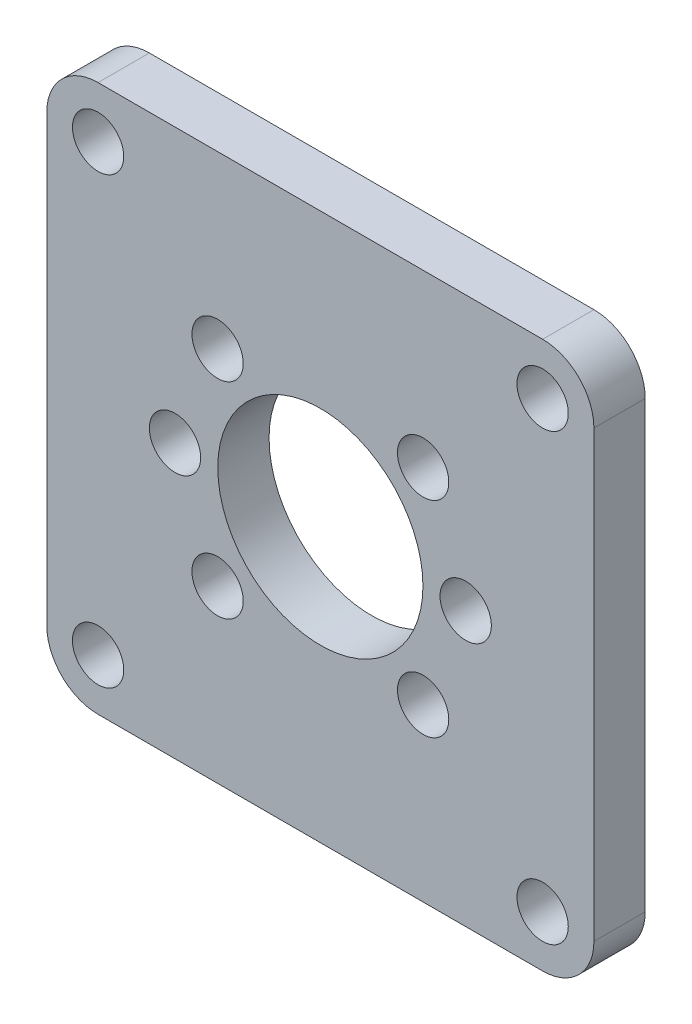
ISO-10303-21;
HEADER;
FILE_DESCRIPTION(('STEP AP214'),'2;1');
FILE_NAME('part.step','',(''),(''),'','','');
FILE_SCHEMA(('AUTOMOTIVE_DESIGN { 1 0 10303 214 1 1 1 1 }'));
ENDSEC;
DATA;
#1=APPLICATION_CONTEXT('core data for automotive mechanical design processes');
#2=APPLICATION_PROTOCOL_DEFINITION('international standard','automotive_design',2000,#1);
#3=PRODUCT_CONTEXT('',#1,'mechanical');
#4=PRODUCT('Part','Part','',(#3));
#5=PRODUCT_RELATED_PRODUCT_CATEGORY('part','',(#4));
#6=PRODUCT_DEFINITION_FORMATION('','',#4);
#7=PRODUCT_DEFINITION_CONTEXT('part definition',#1,'design');
#8=PRODUCT_DEFINITION('design','',#6,#7);
#9=PRODUCT_DEFINITION_SHAPE('','',#8);
#10=(LENGTH_UNIT() NAMED_UNIT(*) SI_UNIT(.MILLI.,.METRE.));
#11=(NAMED_UNIT(*) PLANE_ANGLE_UNIT() SI_UNIT($,.RADIAN.));
#12=(NAMED_UNIT(*) SI_UNIT($,.STERADIAN.) SOLID_ANGLE_UNIT());
#13=UNCERTAINTY_MEASURE_WITH_UNIT(LENGTH_MEASURE(1.E-05),#10,'distance_accuracy_value','');
#14=(GEOMETRIC_REPRESENTATION_CONTEXT(3) GLOBAL_UNCERTAINTY_ASSIGNED_CONTEXT((#13)) GLOBAL_UNIT_ASSIGNED_CONTEXT((#10,
#11,#12)) REPRESENTATION_CONTEXT('',''));
#15=CARTESIAN_POINT('',(0.,0.,0.));
#16=DIRECTION('',(0.,0.,1.));
#17=DIRECTION('',(1.,0.,0.));
#18=AXIS2_PLACEMENT_3D('',#15,#16,#17);
#19=CARTESIAN_POINT('',(-13.,-13.,3.));
#20=DIRECTION('',(0.,0.,-1.));
#21=DIRECTION('',(-1.,0.,0.));
#22=AXIS2_PLACEMENT_3D('',#19,#20,#21);
#23=CYLINDRICAL_SURFACE('',#22,3.);
#24=CARTESIAN_POINT('',(-13.,-13.,0.));
#25=DIRECTION('',(0.,0.,1.));
#26=DIRECTION('',(1.,0.,0.));
#27=AXIS2_PLACEMENT_3D('',#24,#25,#26);
#28=CIRCLE('',#27,3.);
#29=CARTESIAN_POINT('',(-16.,-13.,0.));
#30=VERTEX_POINT('',#29);
#31=CARTESIAN_POINT('',(-13.,-16.,0.));
#32=VERTEX_POINT('',#31);
#33=EDGE_CURVE('E140',#30,#32,#28,.T.);
#34=ORIENTED_EDGE('',*,*,#33,.T.);
#35=DIRECTION('',(0.,0.,-1.));
#36=VECTOR('',#35,1.);
#37=CARTESIAN_POINT('',(-13.,-16.,3.));
#38=LINE('',#37,#36);
#39=CARTESIAN_POINT('',(-13.,-16.,3.));
#40=VERTEX_POINT('',#39);
#41=EDGE_CURVE('E11',#40,#32,#38,.T.);
#42=ORIENTED_EDGE('',*,*,#41,.F.);
#43=CARTESIAN_POINT('',(-13.,-13.,3.));
#44=DIRECTION('',(0.,0.,1.));
#45=DIRECTION('',(1.,0.,0.));
#46=AXIS2_PLACEMENT_3D('',#43,#44,#45);
#47=CIRCLE('',#46,3.);
#48=CARTESIAN_POINT('',(-16.,-13.,3.));
#49=VERTEX_POINT('',#48);
#50=EDGE_CURVE('E163',#49,#40,#47,.T.);
#51=ORIENTED_EDGE('',*,*,#50,.F.);
#52=DIRECTION('',(0.,0.,-1.));
#53=VECTOR('',#52,1.);
#54=CARTESIAN_POINT('',(-16.,-13.,3.));
#55=LINE('',#54,#53);
#56=EDGE_CURVE('E136',#49,#30,#55,.T.);
#57=ORIENTED_EDGE('',*,*,#56,.T.);
#58=EDGE_LOOP('',(#34,#42,#51,#57));
#59=FACE_BOUND('',#58,.T.);
#60=ADVANCED_FACE('F39',(#59),#23,.T.);
#61=CARTESIAN_POINT('',(-13.,-16.,3.));
#62=DIRECTION('',(0.,1.,0.));
#63=DIRECTION('',(0.,0.,1.));
#64=AXIS2_PLACEMENT_3D('',#61,#62,#63);
#65=PLANE('',#64);
#66=DIRECTION('',(1.,0.,0.));
#67=VECTOR('',#66,1.);
#68=CARTESIAN_POINT('',(-13.,-16.,0.));
#69=LINE('',#68,#67);
#70=CARTESIAN_POINT('',(13.,-16.,0.));
#71=VERTEX_POINT('',#70);
#72=EDGE_CURVE('E144',#32,#71,#69,.T.);
#73=ORIENTED_EDGE('',*,*,#72,.T.);
#74=DIRECTION('',(0.,0.,-1.));
#75=VECTOR('',#74,1.);
#76=CARTESIAN_POINT('',(13.,-16.,3.));
#77=LINE('',#76,#75);
#78=CARTESIAN_POINT('',(13.,-16.,3.));
#79=VERTEX_POINT('',#78);
#80=EDGE_CURVE('E48',#79,#71,#77,.T.);
#81=ORIENTED_EDGE('',*,*,#80,.F.);
#82=DIRECTION('',(1.,0.,0.));
#83=VECTOR('',#82,1.);
#84=CARTESIAN_POINT('',(-13.,-16.,3.));
#85=LINE('',#84,#83);
#86=EDGE_CURVE('E99',#40,#79,#85,.T.);
#87=ORIENTED_EDGE('',*,*,#86,.F.);
#88=ORIENTED_EDGE('',*,*,#41,.T.);
#89=EDGE_LOOP('',(#73,#81,#87,#88));
#90=FACE_BOUND('',#89,.T.);
#91=ADVANCED_FACE('F343',(#90),#65,.F.);
#92=CARTESIAN_POINT('',(13.,-13.,3.));
#93=DIRECTION('',(0.,0.,-1.));
#94=DIRECTION('',(-1.,0.,0.));
#95=AXIS2_PLACEMENT_3D('',#92,#93,#94);
#96=CYLINDRICAL_SURFACE('',#95,3.);
#97=CARTESIAN_POINT('',(13.,-13.,0.));
#98=DIRECTION('',(0.,0.,1.));
#99=DIRECTION('',(1.,0.,0.));
#100=AXIS2_PLACEMENT_3D('',#97,#98,#99);
#101=CIRCLE('',#100,3.);
#102=CARTESIAN_POINT('',(16.,-13.,0.));
#103=VERTEX_POINT('',#102);
#104=EDGE_CURVE('E148',#71,#103,#101,.T.);
#105=ORIENTED_EDGE('',*,*,#104,.T.);
#106=DIRECTION('',(0.,0.,-1.));
#107=VECTOR('',#106,1.);
#108=CARTESIAN_POINT('',(16.,-13.,3.));
#109=LINE('',#108,#107);
#110=CARTESIAN_POINT('',(16.,-13.,3.));
#111=VERTEX_POINT('',#110);
#112=EDGE_CURVE('E174',#111,#103,#109,.T.);
#113=ORIENTED_EDGE('',*,*,#112,.F.);
#114=CARTESIAN_POINT('',(13.,-13.,3.));
#115=DIRECTION('',(0.,0.,1.));
#116=DIRECTION('',(1.,0.,0.));
#117=AXIS2_PLACEMENT_3D('',#114,#115,#116);
#118=CIRCLE('',#117,3.);
#119=EDGE_CURVE('E184',#79,#111,#118,.T.);
#120=ORIENTED_EDGE('',*,*,#119,.F.);
#121=ORIENTED_EDGE('',*,*,#80,.T.);
#122=EDGE_LOOP('',(#105,#113,#120,#121));
#123=FACE_BOUND('',#122,.T.);
#124=ADVANCED_FACE('F182',(#123),#96,.T.);
#125=CARTESIAN_POINT('',(16.,-13.,3.));
#126=DIRECTION('',(-1.,0.,0.));
#127=DIRECTION('',(0.,-1.,0.));
#128=AXIS2_PLACEMENT_3D('',#125,#126,#127);
#129=PLANE('',#128);
#130=DIRECTION('',(0.,1.,0.));
#131=VECTOR('',#130,1.);
#132=CARTESIAN_POINT('',(16.,-13.,0.));
#133=LINE('',#132,#131);
#134=CARTESIAN_POINT('',(16.,13.,0.));
#135=VERTEX_POINT('',#134);
#136=EDGE_CURVE('E151',#103,#135,#133,.T.);
#137=ORIENTED_EDGE('',*,*,#136,.T.);
#138=DIRECTION('',(0.,0.,-1.));
#139=VECTOR('',#138,1.);
#140=CARTESIAN_POINT('',(16.,13.,3.));
#141=LINE('',#140,#139);
#142=CARTESIAN_POINT('',(16.,13.,3.));
#143=VERTEX_POINT('',#142);
#144=EDGE_CURVE('E170',#143,#135,#141,.T.);
#145=ORIENTED_EDGE('',*,*,#144,.F.);
#146=DIRECTION('',(0.,1.,0.));
#147=VECTOR('',#146,1.);
#148=CARTESIAN_POINT('',(16.,-13.,3.));
#149=LINE('',#148,#147);
#150=EDGE_CURVE('E197',#111,#143,#149,.T.);
#151=ORIENTED_EDGE('',*,*,#150,.F.);
#152=ORIENTED_EDGE('',*,*,#112,.T.);
#153=EDGE_LOOP('',(#137,#145,#151,#152));
#154=FACE_BOUND('',#153,.T.);
#155=ADVANCED_FACE('F192',(#154),#129,.F.);
#156=CARTESIAN_POINT('',(13.,13.,3.));
#157=DIRECTION('',(0.,0.,-1.));
#158=DIRECTION('',(-1.,0.,0.));
#159=AXIS2_PLACEMENT_3D('',#156,#157,#158);
#160=CYLINDRICAL_SURFACE('',#159,3.);
#161=CARTESIAN_POINT('',(13.,13.,0.));
#162=DIRECTION('',(0.,0.,1.));
#163=DIRECTION('',(1.,0.,0.));
#164=AXIS2_PLACEMENT_3D('',#161,#162,#163);
#165=CIRCLE('',#164,3.);
#166=CARTESIAN_POINT('',(13.,16.,0.));
#167=VERTEX_POINT('',#166);
#168=EDGE_CURVE('E154',#135,#167,#165,.T.);
#169=ORIENTED_EDGE('',*,*,#168,.T.);
#170=DIRECTION('',(0.,0.,-1.));
#171=VECTOR('',#170,1.);
#172=CARTESIAN_POINT('',(13.,16.,3.));
#173=LINE('',#172,#171);
#174=CARTESIAN_POINT('',(13.,16.,3.));
#175=VERTEX_POINT('',#174);
#176=EDGE_CURVE('E129',#175,#167,#173,.T.);
#177=ORIENTED_EDGE('',*,*,#176,.F.);
#178=CARTESIAN_POINT('',(13.,13.,3.));
#179=DIRECTION('',(0.,0.,1.));
#180=DIRECTION('',(1.,0.,0.));
#181=AXIS2_PLACEMENT_3D('',#178,#179,#180);
#182=CIRCLE('',#181,3.);
#183=EDGE_CURVE('E118',#143,#175,#182,.T.);
#184=ORIENTED_EDGE('',*,*,#183,.F.);
#185=ORIENTED_EDGE('',*,*,#144,.T.);
#186=EDGE_LOOP('',(#169,#177,#184,#185));
#187=FACE_BOUND('',#186,.T.);
#188=ADVANCED_FACE('F195',(#187),#160,.T.);
#189=CARTESIAN_POINT('',(-13.,16.,3.));
#190=DIRECTION('',(0.,-1.,0.));
#191=DIRECTION('',(1.,0.,0.));
#192=AXIS2_PLACEMENT_3D('',#189,#190,#191);
#193=PLANE('',#192);
#194=DIRECTION('',(-1.,0.,0.));
#195=VECTOR('',#194,1.);
#196=CARTESIAN_POINT('',(-13.,16.,0.));
#197=LINE('',#196,#195);
#198=CARTESIAN_POINT('',(-13.,16.,0.));
#199=VERTEX_POINT('',#198);
#200=EDGE_CURVE('E127',#167,#199,#197,.T.);
#201=ORIENTED_EDGE('',*,*,#200,.T.);
#202=DIRECTION('',(0.,0.,-1.));
#203=VECTOR('',#202,1.);
#204=CARTESIAN_POINT('',(-13.,16.,3.));
#205=LINE('',#204,#203);
#206=CARTESIAN_POINT('',(-13.,16.,3.));
#207=VERTEX_POINT('',#206);
#208=EDGE_CURVE('E124',#207,#199,#205,.T.);
#209=ORIENTED_EDGE('',*,*,#208,.F.);
#210=DIRECTION('',(-1.,0.,0.));
#211=VECTOR('',#210,1.);
#212=CARTESIAN_POINT('',(-13.,16.,3.));
#213=LINE('',#212,#211);
#214=EDGE_CURVE('E112',#175,#207,#213,.T.);
#215=ORIENTED_EDGE('',*,*,#214,.F.);
#216=ORIENTED_EDGE('',*,*,#176,.T.);
#217=EDGE_LOOP('',(#201,#209,#215,#216));
#218=FACE_BOUND('',#217,.T.);
#219=ADVANCED_FACE('F125',(#218),#193,.F.);
#220=CARTESIAN_POINT('',(-13.,13.,3.));
#221=DIRECTION('',(0.,0.,-1.));
#222=DIRECTION('',(-1.,0.,0.));
#223=AXIS2_PLACEMENT_3D('',#220,#221,#222);
#224=CYLINDRICAL_SURFACE('',#223,3.);
#225=CARTESIAN_POINT('',(-13.,13.,0.));
#226=DIRECTION('',(0.,0.,1.));
#227=DIRECTION('',(1.,0.,0.));
#228=AXIS2_PLACEMENT_3D('',#225,#226,#227);
#229=CIRCLE('',#228,3.);
#230=CARTESIAN_POINT('',(-16.,13.,0.));
#231=VERTEX_POINT('',#230);
#232=EDGE_CURVE('E85',#199,#231,#229,.T.);
#233=ORIENTED_EDGE('',*,*,#232,.T.);
#234=DIRECTION('',(0.,0.,-1.));
#235=VECTOR('',#234,1.);
#236=CARTESIAN_POINT('',(-16.,13.,3.));
#237=LINE('',#236,#235);
#238=CARTESIAN_POINT('',(-16.,13.,3.));
#239=VERTEX_POINT('',#238);
#240=EDGE_CURVE('E130',#239,#231,#237,.T.);
#241=ORIENTED_EDGE('',*,*,#240,.F.);
#242=CARTESIAN_POINT('',(-13.,13.,3.));
#243=DIRECTION('',(0.,0.,1.));
#244=DIRECTION('',(1.,0.,0.));
#245=AXIS2_PLACEMENT_3D('',#242,#243,#244);
#246=CIRCLE('',#245,3.);
#247=EDGE_CURVE('E116',#207,#239,#246,.T.);
#248=ORIENTED_EDGE('',*,*,#247,.F.);
#249=ORIENTED_EDGE('',*,*,#208,.T.);
#250=EDGE_LOOP('',(#233,#241,#248,#249));
#251=FACE_BOUND('',#250,.T.);
#252=ADVANCED_FACE('F132',(#251),#224,.T.);
#253=CARTESIAN_POINT('',(-16.,-13.,3.));
#254=DIRECTION('',(1.,0.,0.));
#255=DIRECTION('',(0.,1.,0.));
#256=AXIS2_PLACEMENT_3D('',#253,#254,#255);
#257=PLANE('',#256);
#258=DIRECTION('',(0.,-1.,0.));
#259=VECTOR('',#258,1.);
#260=CARTESIAN_POINT('',(-16.,-13.,0.));
#261=LINE('',#260,#259);
#262=EDGE_CURVE('E91',#231,#30,#261,.T.);
#263=ORIENTED_EDGE('',*,*,#262,.T.);
#264=ORIENTED_EDGE('',*,*,#56,.F.);
#265=DIRECTION('',(0.,-1.,0.));
#266=VECTOR('',#265,1.);
#267=CARTESIAN_POINT('',(-16.,-13.,3.));
#268=LINE('',#267,#266);
#269=EDGE_CURVE('E56',#239,#49,#268,.T.);
#270=ORIENTED_EDGE('',*,*,#269,.F.);
#271=ORIENTED_EDGE('',*,*,#240,.T.);
#272=EDGE_LOOP('',(#263,#264,#270,#271));
#273=FACE_BOUND('',#272,.T.);
#274=ADVANCED_FACE('F307',(#273),#257,.F.);
#275=CARTESIAN_POINT('',(-13.,-13.,3.));
#276=DIRECTION('',(0.,0.,1.));
#277=DIRECTION('',(1.,0.,0.));
#278=AXIS2_PLACEMENT_3D('',#275,#276,#277);
#279=PLANE('',#278);
#280=CARTESIAN_POINT('',(-13.,-13.,3.));
#281=DIRECTION('',(0.,0.,1.));
#282=DIRECTION('',(-1.,0.,0.));
#283=AXIS2_PLACEMENT_3D('',#280,#281,#282);
#284=CIRCLE('',#283,1.5);
#285=CARTESIAN_POINT('',(-14.5,-13.,3.));
#286=VERTEX_POINT('',#285);
#287=EDGE_CURVE('E271',#286,#286,#284,.T.);
#288=ORIENTED_EDGE('',*,*,#287,.F.);
#289=EDGE_LOOP('',(#288));
#290=FACE_BOUND('',#289,.T.);
#291=CARTESIAN_POINT('',(13.,-13.,3.));
#292=DIRECTION('',(0.,0.,1.));
#293=DIRECTION('',(1.,0.,0.));
#294=AXIS2_PLACEMENT_3D('',#291,#292,#293);
#295=CIRCLE('',#294,1.5);
#296=CARTESIAN_POINT('',(14.5,-13.,3.));
#297=VERTEX_POINT('',#296);
#298=EDGE_CURVE('E279',#297,#297,#295,.T.);
#299=ORIENTED_EDGE('',*,*,#298,.F.);
#300=EDGE_LOOP('',(#299));
#301=FACE_BOUND('',#300,.T.);
#302=CARTESIAN_POINT('',(13.,13.,3.));
#303=DIRECTION('',(0.,0.,1.));
#304=DIRECTION('',(-1.,0.,0.));
#305=AXIS2_PLACEMENT_3D('',#302,#303,#304);
#306=CIRCLE('',#305,1.5);
#307=CARTESIAN_POINT('',(11.5,13.,3.));
#308=VERTEX_POINT('',#307);
#309=EDGE_CURVE('E287',#308,#308,#306,.T.);
#310=ORIENTED_EDGE('',*,*,#309,.F.);
#311=EDGE_LOOP('',(#310));
#312=FACE_BOUND('',#311,.T.);
#313=CARTESIAN_POINT('',(-13.,13.,3.));
#314=DIRECTION('',(0.,0.,1.));
#315=DIRECTION('',(1.,0.,0.));
#316=AXIS2_PLACEMENT_3D('',#313,#314,#315);
#317=CIRCLE('',#316,1.5);
#318=CARTESIAN_POINT('',(-11.5,13.,3.));
#319=VERTEX_POINT('',#318);
#320=EDGE_CURVE('E263',#319,#319,#317,.T.);
#321=ORIENTED_EDGE('',*,*,#320,.F.);
#322=EDGE_LOOP('',(#321));
#323=FACE_BOUND('',#322,.T.);
#324=CARTESIAN_POINT('',(-8.5,0.,3.));
#325=DIRECTION('',(0.,0.,1.));
#326=DIRECTION('',(1.,0.,0.));
#327=AXIS2_PLACEMENT_3D('',#324,#325,#326);
#328=CIRCLE('',#327,1.5);
#329=CARTESIAN_POINT('',(-7.,0.,3.));
#330=VERTEX_POINT('',#329);
#331=EDGE_CURVE('E240',#330,#330,#328,.T.);
#332=ORIENTED_EDGE('',*,*,#331,.F.);
#333=EDGE_LOOP('',(#332));
#334=FACE_BOUND('',#333,.T.);
#335=CARTESIAN_POINT('',(-6.01040764008564,6.01040764008566,3.));
#336=DIRECTION('',(0.,0.,1.));
#337=DIRECTION('',(1.,0.,0.));
#338=AXIS2_PLACEMENT_3D('',#335,#336,#337);
#339=CIRCLE('',#338,1.5);
#340=CARTESIAN_POINT('',(-4.51040764008565,6.01040764008566,3.));
#341=VERTEX_POINT('',#340);
#342=EDGE_CURVE('E232',#341,#341,#339,.T.);
#343=ORIENTED_EDGE('',*,*,#342,.F.);
#344=EDGE_LOOP('',(#343));
#345=FACE_BOUND('',#344,.T.);
#346=CARTESIAN_POINT('',(-6.01040764008564,-6.01040764008566,3.));
#347=DIRECTION('',(0.,0.,1.));
#348=DIRECTION('',(-1.,0.,0.));
#349=AXIS2_PLACEMENT_3D('',#346,#347,#348);
#350=CIRCLE('',#349,1.5);
#351=CARTESIAN_POINT('',(-7.51040764008564,-6.01040764008566,3.));
#352=VERTEX_POINT('',#351);
#353=EDGE_CURVE('E224',#352,#352,#350,.T.);
#354=ORIENTED_EDGE('',*,*,#353,.F.);
#355=EDGE_LOOP('',(#354));
#356=FACE_BOUND('',#355,.T.);
#357=CARTESIAN_POINT('',(6.01040764008564,-6.01040764008566,3.));
#358=DIRECTION('',(0.,0.,1.));
#359=DIRECTION('',(1.,0.,0.));
#360=AXIS2_PLACEMENT_3D('',#357,#358,#359);
#361=CIRCLE('',#360,1.5);
#362=CARTESIAN_POINT('',(7.51040764008564,-6.01040764008566,3.));
#363=VERTEX_POINT('',#362);
#364=EDGE_CURVE('E215',#363,#363,#361,.T.);
#365=ORIENTED_EDGE('',*,*,#364,.F.);
#366=EDGE_LOOP('',(#365));
#367=FACE_BOUND('',#366,.T.);
#368=CARTESIAN_POINT('',(8.5,0.,3.));
#369=DIRECTION('',(0.,0.,1.));
#370=DIRECTION('',(-1.,0.,0.));
#371=AXIS2_PLACEMENT_3D('',#368,#369,#370);
#372=CIRCLE('',#371,1.5);
#373=CARTESIAN_POINT('',(7.,0.,3.));
#374=VERTEX_POINT('',#373);
#375=EDGE_CURVE('E256',#374,#374,#372,.T.);
#376=ORIENTED_EDGE('',*,*,#375,.F.);
#377=EDGE_LOOP('',(#376));
#378=FACE_BOUND('',#377,.T.);
#379=CARTESIAN_POINT('',(6.01040764008565,6.01040764008566,3.));
#380=DIRECTION('',(0.,0.,1.));
#381=DIRECTION('',(-1.,0.,0.));
#382=AXIS2_PLACEMENT_3D('',#379,#380,#381);
#383=CIRCLE('',#382,1.5);
#384=CARTESIAN_POINT('',(4.51040764008565,6.01040764008566,3.));
#385=VERTEX_POINT('',#384);
#386=EDGE_CURVE('E247',#385,#385,#383,.T.);
#387=ORIENTED_EDGE('',*,*,#386,.F.);
#388=EDGE_LOOP('',(#387));
#389=FACE_BOUND('',#388,.T.);
#390=CARTESIAN_POINT('',(0.,0.,3.));
#391=DIRECTION('',(0.,0.,1.));
#392=DIRECTION('',(1.,0.,0.));
#393=AXIS2_PLACEMENT_3D('',#390,#391,#392);
#394=CIRCLE('',#393,6.);
#395=CARTESIAN_POINT('',(6.,0.,3.));
#396=VERTEX_POINT('',#395);
#397=EDGE_CURVE('E207',#396,#396,#394,.T.);
#398=ORIENTED_EDGE('',*,*,#397,.F.);
#399=EDGE_LOOP('',(#398));
#400=FACE_BOUND('',#399,.T.);
#401=ORIENTED_EDGE('',*,*,#50,.T.);
#402=ORIENTED_EDGE('',*,*,#86,.T.);
#403=ORIENTED_EDGE('',*,*,#119,.T.);
#404=ORIENTED_EDGE('',*,*,#150,.T.);
#405=ORIENTED_EDGE('',*,*,#183,.T.);
#406=ORIENTED_EDGE('',*,*,#214,.T.);
#407=ORIENTED_EDGE('',*,*,#247,.T.);
#408=ORIENTED_EDGE('',*,*,#269,.T.);
#409=EDGE_LOOP('',(#401,#402,#403,#404,#405,#406,#407,#408));
#410=FACE_BOUND('',#409,.T.);
#411=ADVANCED_FACE('F114',(#290,#301,#312,#323,#334,#345,#356,#367,#378,#389,#400,#410),#279,.T.);
#412=CARTESIAN_POINT('',(-13.,-13.,0.));
#413=DIRECTION('',(0.,0.,1.));
#414=DIRECTION('',(1.,0.,0.));
#415=AXIS2_PLACEMENT_3D('',#412,#413,#414);
#416=PLANE('',#415);
#417=CARTESIAN_POINT('',(-13.,-13.,0.));
#418=DIRECTION('',(0.,0.,1.));
#419=DIRECTION('',(-1.,0.,0.));
#420=AXIS2_PLACEMENT_3D('',#417,#418,#419);
#421=CIRCLE('',#420,1.5);
#422=CARTESIAN_POINT('',(-14.5,-13.,0.));
#423=VERTEX_POINT('',#422);
#424=EDGE_CURVE('E275',#423,#423,#421,.T.);
#425=ORIENTED_EDGE('',*,*,#424,.T.);
#426=EDGE_LOOP('',(#425));
#427=FACE_BOUND('',#426,.T.);
#428=CARTESIAN_POINT('',(13.,-13.,0.));
#429=DIRECTION('',(0.,0.,1.));
#430=DIRECTION('',(1.,0.,0.));
#431=AXIS2_PLACEMENT_3D('',#428,#429,#430);
#432=CIRCLE('',#431,1.5);
#433=CARTESIAN_POINT('',(14.5,-13.,0.));
#434=VERTEX_POINT('',#433);
#435=EDGE_CURVE('E283',#434,#434,#432,.T.);
#436=ORIENTED_EDGE('',*,*,#435,.T.);
#437=EDGE_LOOP('',(#436));
#438=FACE_BOUND('',#437,.T.);
#439=CARTESIAN_POINT('',(13.,13.,0.));
#440=DIRECTION('',(0.,0.,1.));
#441=DIRECTION('',(-1.,0.,0.));
#442=AXIS2_PLACEMENT_3D('',#439,#440,#441);
#443=CIRCLE('',#442,1.5);
#444=CARTESIAN_POINT('',(11.5,13.,0.));
#445=VERTEX_POINT('',#444);
#446=EDGE_CURVE('E267',#445,#445,#443,.T.);
#447=ORIENTED_EDGE('',*,*,#446,.T.);
#448=EDGE_LOOP('',(#447));
#449=FACE_BOUND('',#448,.T.);
#450=CARTESIAN_POINT('',(-13.,13.,0.));
#451=DIRECTION('',(0.,0.,1.));
#452=DIRECTION('',(1.,0.,0.));
#453=AXIS2_PLACEMENT_3D('',#450,#451,#452);
#454=CIRCLE('',#453,1.5);
#455=CARTESIAN_POINT('',(-11.5,13.,0.));
#456=VERTEX_POINT('',#455);
#457=EDGE_CURVE('E252',#456,#456,#454,.T.);
#458=ORIENTED_EDGE('',*,*,#457,.T.);
#459=EDGE_LOOP('',(#458));
#460=FACE_BOUND('',#459,.T.);
#461=CARTESIAN_POINT('',(-8.5,0.,0.));
#462=DIRECTION('',(0.,0.,1.));
#463=DIRECTION('',(1.,0.,0.));
#464=AXIS2_PLACEMENT_3D('',#461,#462,#463);
#465=CIRCLE('',#464,1.5);
#466=CARTESIAN_POINT('',(-7.,0.,0.));
#467=VERTEX_POINT('',#466);
#468=EDGE_CURVE('E211',#467,#467,#465,.T.);
#469=ORIENTED_EDGE('',*,*,#468,.T.);
#470=EDGE_LOOP('',(#469));
#471=FACE_BOUND('',#470,.T.);
#472=CARTESIAN_POINT('',(-6.01040764008564,6.01040764008566,0.));
#473=DIRECTION('',(0.,0.,1.));
#474=DIRECTION('',(1.,0.,0.));
#475=AXIS2_PLACEMENT_3D('',#472,#473,#474);
#476=CIRCLE('',#475,1.5);
#477=CARTESIAN_POINT('',(-4.51040764008565,6.01040764008566,0.));
#478=VERTEX_POINT('',#477);
#479=EDGE_CURVE('E236',#478,#478,#476,.T.);
#480=ORIENTED_EDGE('',*,*,#479,.T.);
#481=EDGE_LOOP('',(#480));
#482=FACE_BOUND('',#481,.T.);
#483=CARTESIAN_POINT('',(-6.01040764008564,-6.01040764008566,0.));
#484=DIRECTION('',(0.,0.,1.));
#485=DIRECTION('',(-1.,0.,0.));
#486=AXIS2_PLACEMENT_3D('',#483,#484,#485);
#487=CIRCLE('',#486,1.5);
#488=CARTESIAN_POINT('',(-7.51040764008564,-6.01040764008566,0.));
#489=VERTEX_POINT('',#488);
#490=EDGE_CURVE('E228',#489,#489,#487,.T.);
#491=ORIENTED_EDGE('',*,*,#490,.T.);
#492=EDGE_LOOP('',(#491));
#493=FACE_BOUND('',#492,.T.);
#494=CARTESIAN_POINT('',(6.01040764008564,-6.01040764008566,0.));
#495=DIRECTION('',(0.,0.,1.));
#496=DIRECTION('',(1.,0.,0.));
#497=AXIS2_PLACEMENT_3D('',#494,#495,#496);
#498=CIRCLE('',#497,1.5);
#499=CARTESIAN_POINT('',(7.51040764008564,-6.01040764008566,0.));
#500=VERTEX_POINT('',#499);
#501=EDGE_CURVE('E219',#500,#500,#498,.T.);
#502=ORIENTED_EDGE('',*,*,#501,.T.);
#503=EDGE_LOOP('',(#502));
#504=FACE_BOUND('',#503,.T.);
#505=CARTESIAN_POINT('',(8.5,0.,0.));
#506=DIRECTION('',(0.,0.,1.));
#507=DIRECTION('',(-1.,0.,0.));
#508=AXIS2_PLACEMENT_3D('',#505,#506,#507);
#509=CIRCLE('',#508,1.5);
#510=CARTESIAN_POINT('',(7.,0.,0.));
#511=VERTEX_POINT('',#510);
#512=EDGE_CURVE('E220',#511,#511,#509,.T.);
#513=ORIENTED_EDGE('',*,*,#512,.T.);
#514=EDGE_LOOP('',(#513));
#515=FACE_BOUND('',#514,.T.);
#516=CARTESIAN_POINT('',(6.01040764008565,6.01040764008566,0.));
#517=DIRECTION('',(0.,0.,1.));
#518=DIRECTION('',(-1.,0.,0.));
#519=AXIS2_PLACEMENT_3D('',#516,#517,#518);
#520=CIRCLE('',#519,1.5);
#521=CARTESIAN_POINT('',(4.51040764008565,6.01040764008566,0.));
#522=VERTEX_POINT('',#521);
#523=EDGE_CURVE('E251',#522,#522,#520,.T.);
#524=ORIENTED_EDGE('',*,*,#523,.T.);
#525=EDGE_LOOP('',(#524));
#526=FACE_BOUND('',#525,.T.);
#527=CARTESIAN_POINT('',(0.,0.,0.));
#528=DIRECTION('',(0.,0.,1.));
#529=DIRECTION('',(1.,0.,0.));
#530=AXIS2_PLACEMENT_3D('',#527,#528,#529);
#531=CIRCLE('',#530,6.);
#532=CARTESIAN_POINT('',(6.,0.,0.));
#533=VERTEX_POINT('',#532);
#534=EDGE_CURVE('E145',#533,#533,#531,.T.);
#535=ORIENTED_EDGE('',*,*,#534,.T.);
#536=EDGE_LOOP('',(#535));
#537=FACE_BOUND('',#536,.T.);
#538=ORIENTED_EDGE('',*,*,#33,.F.);
#539=ORIENTED_EDGE('',*,*,#262,.F.);
#540=ORIENTED_EDGE('',*,*,#232,.F.);
#541=ORIENTED_EDGE('',*,*,#200,.F.);
#542=ORIENTED_EDGE('',*,*,#168,.F.);
#543=ORIENTED_EDGE('',*,*,#136,.F.);
#544=ORIENTED_EDGE('',*,*,#104,.F.);
#545=ORIENTED_EDGE('',*,*,#72,.F.);
#546=EDGE_LOOP('',(#538,#539,#540,#541,#542,#543,#544,#545));
#547=FACE_BOUND('',#546,.T.);
#548=ADVANCED_FACE('F188',(#427,#438,#449,#460,#471,#482,#493,#504,#515,#526,#537,#547),#416,.F.);
#549=CARTESIAN_POINT('',(0.,0.,0.));
#550=DIRECTION('',(0.,0.,1.));
#551=DIRECTION('',(1.,0.,0.));
#552=AXIS2_PLACEMENT_3D('',#549,#550,#551);
#553=CYLINDRICAL_SURFACE('',#552,6.);
#554=ORIENTED_EDGE('',*,*,#534,.F.);
#555=EDGE_LOOP('',(#554));
#556=FACE_BOUND('',#555,.T.);
#557=ORIENTED_EDGE('',*,*,#397,.T.);
#558=EDGE_LOOP('',(#557));
#559=FACE_BOUND('',#558,.T.);
#560=ADVANCED_FACE('F326',(#556,#559),#553,.F.);
#561=CARTESIAN_POINT('',(6.01040764008565,6.01040764008566,0.));
#562=DIRECTION('',(0.,0.,1.));
#563=DIRECTION('',(1.,0.,0.));
#564=AXIS2_PLACEMENT_3D('',#561,#562,#563);
#565=CYLINDRICAL_SURFACE('',#564,1.5);
#566=ORIENTED_EDGE('',*,*,#523,.F.);
#567=EDGE_LOOP('',(#566));
#568=FACE_BOUND('',#567,.T.);
#569=ORIENTED_EDGE('',*,*,#386,.T.);
#570=EDGE_LOOP('',(#569));
#571=FACE_BOUND('',#570,.T.);
#572=ADVANCED_FACE('F328',(#568,#571),#565,.F.);
#573=CARTESIAN_POINT('',(8.5,0.,0.));
#574=DIRECTION('',(0.,0.,1.));
#575=DIRECTION('',(1.,0.,0.));
#576=AXIS2_PLACEMENT_3D('',#573,#574,#575);
#577=CYLINDRICAL_SURFACE('',#576,1.5);
#578=ORIENTED_EDGE('',*,*,#512,.F.);
#579=EDGE_LOOP('',(#578));
#580=FACE_BOUND('',#579,.T.);
#581=ORIENTED_EDGE('',*,*,#375,.T.);
#582=EDGE_LOOP('',(#581));
#583=FACE_BOUND('',#582,.T.);
#584=ADVANCED_FACE('F335',(#580,#583),#577,.F.);
#585=CARTESIAN_POINT('',(6.01040764008564,-6.01040764008566,0.));
#586=DIRECTION('',(0.,0.,1.));
#587=DIRECTION('',(1.,0.,0.));
#588=AXIS2_PLACEMENT_3D('',#585,#586,#587);
#589=CYLINDRICAL_SURFACE('',#588,1.5);
#590=ORIENTED_EDGE('',*,*,#501,.F.);
#591=EDGE_LOOP('',(#590));
#592=FACE_BOUND('',#591,.T.);
#593=ORIENTED_EDGE('',*,*,#364,.T.);
#594=EDGE_LOOP('',(#593));
#595=FACE_BOUND('',#594,.T.);
#596=ADVANCED_FACE('F409',(#592,#595),#589,.F.);
#597=CARTESIAN_POINT('',(-6.01040764008564,-6.01040764008566,0.));
#598=DIRECTION('',(0.,0.,1.));
#599=DIRECTION('',(1.,0.,0.));
#600=AXIS2_PLACEMENT_3D('',#597,#598,#599);
#601=CYLINDRICAL_SURFACE('',#600,1.5);
#602=ORIENTED_EDGE('',*,*,#490,.F.);
#603=EDGE_LOOP('',(#602));
#604=FACE_BOUND('',#603,.T.);
#605=ORIENTED_EDGE('',*,*,#353,.T.);
#606=EDGE_LOOP('',(#605));
#607=FACE_BOUND('',#606,.T.);
#608=ADVANCED_FACE('F419',(#604,#607),#601,.F.);
#609=CARTESIAN_POINT('',(-6.01040764008564,6.01040764008566,0.));
#610=DIRECTION('',(0.,0.,1.));
#611=DIRECTION('',(1.,0.,0.));
#612=AXIS2_PLACEMENT_3D('',#609,#610,#611);
#613=CYLINDRICAL_SURFACE('',#612,1.5);
#614=ORIENTED_EDGE('',*,*,#479,.F.);
#615=EDGE_LOOP('',(#614));
#616=FACE_BOUND('',#615,.T.);
#617=ORIENTED_EDGE('',*,*,#342,.T.);
#618=EDGE_LOOP('',(#617));
#619=FACE_BOUND('',#618,.T.);
#620=ADVANCED_FACE('F428',(#616,#619),#613,.F.);
#621=CARTESIAN_POINT('',(-8.5,0.,0.));
#622=DIRECTION('',(0.,0.,1.));
#623=DIRECTION('',(1.,0.,0.));
#624=AXIS2_PLACEMENT_3D('',#621,#622,#623);
#625=CYLINDRICAL_SURFACE('',#624,1.5);
#626=ORIENTED_EDGE('',*,*,#468,.F.);
#627=EDGE_LOOP('',(#626));
#628=FACE_BOUND('',#627,.T.);
#629=ORIENTED_EDGE('',*,*,#331,.T.);
#630=EDGE_LOOP('',(#629));
#631=FACE_BOUND('',#630,.T.);
#632=ADVANCED_FACE('F438',(#628,#631),#625,.F.);
#633=CARTESIAN_POINT('',(-13.,13.,0.));
#634=DIRECTION('',(0.,0.,1.));
#635=DIRECTION('',(1.,0.,0.));
#636=AXIS2_PLACEMENT_3D('',#633,#634,#635);
#637=CYLINDRICAL_SURFACE('',#636,1.5);
#638=ORIENTED_EDGE('',*,*,#457,.F.);
#639=EDGE_LOOP('',(#638));
#640=FACE_BOUND('',#639,.T.);
#641=ORIENTED_EDGE('',*,*,#320,.T.);
#642=EDGE_LOOP('',(#641));
#643=FACE_BOUND('',#642,.T.);
#644=ADVANCED_FACE('F301',(#640,#643),#637,.F.);
#645=CARTESIAN_POINT('',(13.,13.,0.));
#646=DIRECTION('',(0.,0.,1.));
#647=DIRECTION('',(1.,0.,0.));
#648=AXIS2_PLACEMENT_3D('',#645,#646,#647);
#649=CYLINDRICAL_SURFACE('',#648,1.5);
#650=ORIENTED_EDGE('',*,*,#446,.F.);
#651=EDGE_LOOP('',(#650));
#652=FACE_BOUND('',#651,.T.);
#653=ORIENTED_EDGE('',*,*,#309,.T.);
#654=EDGE_LOOP('',(#653));
#655=FACE_BOUND('',#654,.T.);
#656=ADVANCED_FACE('F297',(#652,#655),#649,.F.);
#657=CARTESIAN_POINT('',(13.,-13.,0.));
#658=DIRECTION('',(0.,0.,1.));
#659=DIRECTION('',(1.,0.,0.));
#660=AXIS2_PLACEMENT_3D('',#657,#658,#659);
#661=CYLINDRICAL_SURFACE('',#660,1.5);
#662=ORIENTED_EDGE('',*,*,#435,.F.);
#663=EDGE_LOOP('',(#662));
#664=FACE_BOUND('',#663,.T.);
#665=ORIENTED_EDGE('',*,*,#298,.T.);
#666=EDGE_LOOP('',(#665));
#667=FACE_BOUND('',#666,.T.);
#668=ADVANCED_FACE('F300',(#664,#667),#661,.F.);
#669=CARTESIAN_POINT('',(-13.,-13.,0.));
#670=DIRECTION('',(0.,0.,1.));
#671=DIRECTION('',(1.,0.,0.));
#672=AXIS2_PLACEMENT_3D('',#669,#670,#671);
#673=CYLINDRICAL_SURFACE('',#672,1.5);
#674=ORIENTED_EDGE('',*,*,#424,.F.);
#675=EDGE_LOOP('',(#674));
#676=FACE_BOUND('',#675,.T.);
#677=ORIENTED_EDGE('',*,*,#287,.T.);
#678=EDGE_LOOP('',(#677));
#679=FACE_BOUND('',#678,.T.);
#680=ADVANCED_FACE('F482',(#676,#679),#673,.F.);
#681=CLOSED_SHELL('',(#60,#91,#124,#155,#188,#219,#252,#274,#411,#548,#560,#572,#584,#596,#608,
#620,#632,#644,#656,#668,#680));
#682=MANIFOLD_SOLID_BREP('B2',#681);
#683=ADVANCED_BREP_SHAPE_REPRESENTATION('',(#18,#682),#14);
#684=SHAPE_DEFINITION_REPRESENTATION(#9,#683);
ENDSEC;
END-ISO-10303-21;
